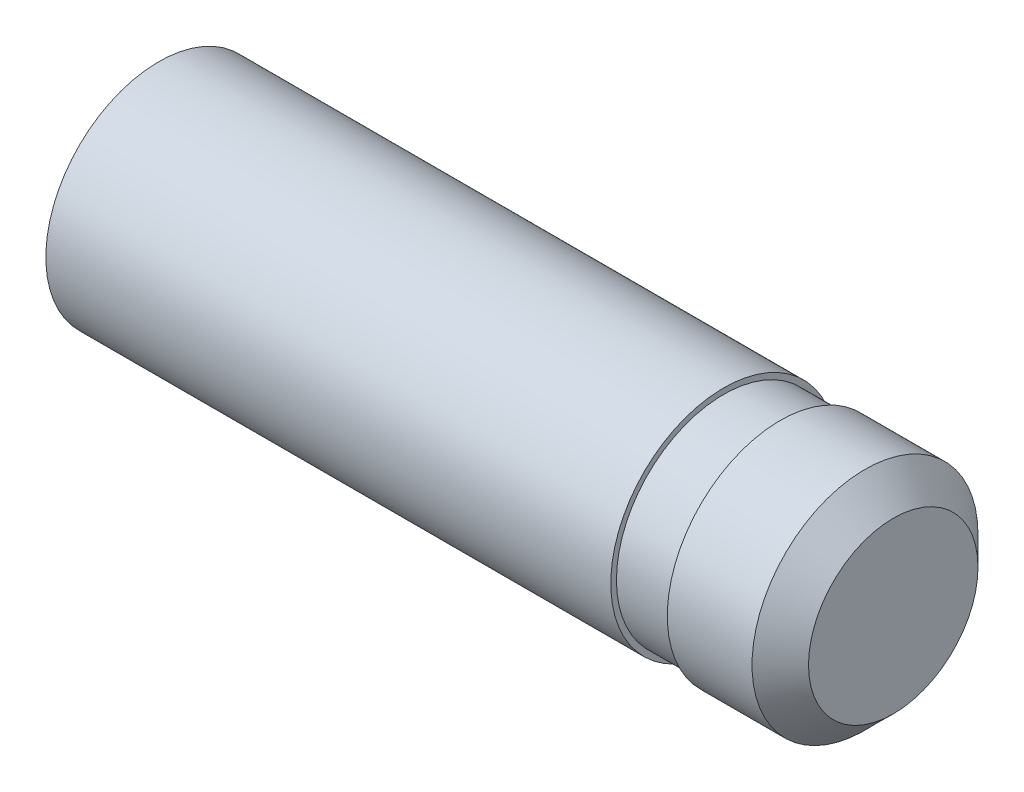
ISO-10303-21;
HEADER;
FILE_DESCRIPTION(('STEP AP214'),'2;1');
FILE_NAME('part.step','',(''),(''),'','','');
FILE_SCHEMA(('AUTOMOTIVE_DESIGN { 1 0 10303 214 1 1 1 1 }'));
ENDSEC;
DATA;
#1=APPLICATION_CONTEXT('core data for automotive mechanical design processes');
#2=APPLICATION_PROTOCOL_DEFINITION('international standard','automotive_design',2000,#1);
#3=PRODUCT_CONTEXT('',#1,'mechanical');
#4=PRODUCT('Part','Part','',(#3));
#5=PRODUCT_RELATED_PRODUCT_CATEGORY('part','',(#4));
#6=PRODUCT_DEFINITION_FORMATION('','',#4);
#7=PRODUCT_DEFINITION_CONTEXT('part definition',#1,'design');
#8=PRODUCT_DEFINITION('design','',#6,#7);
#9=PRODUCT_DEFINITION_SHAPE('','',#8);
#10=(LENGTH_UNIT() NAMED_UNIT(*) SI_UNIT(.MILLI.,.METRE.));
#11=(NAMED_UNIT(*) PLANE_ANGLE_UNIT() SI_UNIT($,.RADIAN.));
#12=(NAMED_UNIT(*) SI_UNIT($,.STERADIAN.) SOLID_ANGLE_UNIT());
#13=UNCERTAINTY_MEASURE_WITH_UNIT(LENGTH_MEASURE(1.E-05),#10,'distance_accuracy_value','');
#14=(GEOMETRIC_REPRESENTATION_CONTEXT(3) GLOBAL_UNCERTAINTY_ASSIGNED_CONTEXT((#13)) GLOBAL_UNIT_ASSIGNED_CONTEXT((#10,
#11,#12)) REPRESENTATION_CONTEXT('',''));
#15=CARTESIAN_POINT('',(0.,0.,0.));
#16=DIRECTION('',(0.,0.,1.));
#17=DIRECTION('',(1.,0.,0.));
#18=AXIS2_PLACEMENT_3D('',#15,#16,#17);
#19=CARTESIAN_POINT('',(10.,0.,0.));
#20=DIRECTION('',(-1.,0.,0.));
#21=DIRECTION('',(0.,0.,1.));
#22=AXIS2_PLACEMENT_3D('',#19,#20,#21);
#23=CYLINDRICAL_SURFACE('',#22,2.);
#24=CARTESIAN_POINT('',(10.,0.,0.));
#25=DIRECTION('',(1.,0.,0.));
#26=DIRECTION('',(0.,0.,-1.));
#27=AXIS2_PLACEMENT_3D('',#24,#25,#26);
#28=CIRCLE('',#27,2.);
#29=CARTESIAN_POINT('',(10.,0.,-2.));
#30=VERTEX_POINT('',#29);
#31=EDGE_CURVE('E55',#30,#30,#28,.T.);
#32=ORIENTED_EDGE('',*,*,#31,.F.);
#33=EDGE_LOOP('',(#32));
#34=FACE_BOUND('',#33,.T.);
#35=CARTESIAN_POINT('',(0.,0.,0.));
#36=DIRECTION('',(1.,0.,0.));
#37=DIRECTION('',(0.,0.,-1.));
#38=AXIS2_PLACEMENT_3D('',#35,#36,#37);
#39=CIRCLE('',#38,2.);
#40=CARTESIAN_POINT('',(0.,0.,-2.));
#41=VERTEX_POINT('',#40);
#42=EDGE_CURVE('E58',#41,#41,#39,.T.);
#43=ORIENTED_EDGE('',*,*,#42,.T.);
#44=EDGE_LOOP('',(#43));
#45=FACE_BOUND('',#44,.T.);
#46=ADVANCED_FACE('F39',(#34,#45),#23,.T.);
#47=CARTESIAN_POINT('',(10.,0.,0.));
#48=DIRECTION('',(1.,0.,0.));
#49=DIRECTION('',(0.,0.,-1.));
#50=AXIS2_PLACEMENT_3D('',#47,#48,#49);
#51=PLANE('',#50);
#52=CARTESIAN_POINT('',(10.,0.,0.));
#53=DIRECTION('',(1.,0.,0.));
#54=DIRECTION('',(0.,0.,-1.));
#55=AXIS2_PLACEMENT_3D('',#52,#53,#54);
#56=CIRCLE('',#55,1.9);
#57=CARTESIAN_POINT('',(10.,0.,-1.9));
#58=VERTEX_POINT('',#57);
#59=EDGE_CURVE('E51',#58,#58,#56,.T.);
#60=ORIENTED_EDGE('',*,*,#59,.F.);
#61=EDGE_LOOP('',(#60));
#62=FACE_BOUND('',#61,.T.);
#63=ORIENTED_EDGE('',*,*,#31,.T.);
#64=EDGE_LOOP('',(#63));
#65=FACE_BOUND('',#64,.T.);
#66=ADVANCED_FACE('F87',(#62,#65),#51,.T.);
#67=CARTESIAN_POINT('',(0.,0.,0.));
#68=DIRECTION('',(1.,0.,0.));
#69=DIRECTION('',(0.,0.,-1.));
#70=AXIS2_PLACEMENT_3D('',#67,#68,#69);
#71=PLANE('',#70);
#72=ORIENTED_EDGE('',*,*,#42,.F.);
#73=EDGE_LOOP('',(#72));
#74=FACE_BOUND('',#73,.T.);
#75=ADVANCED_FACE('F93',(#74),#71,.F.);
#76=CARTESIAN_POINT('',(11.,0.,0.));
#77=DIRECTION('',(-1.,0.,0.));
#78=DIRECTION('',(0.,0.,1.));
#79=AXIS2_PLACEMENT_3D('',#76,#77,#78);
#80=CYLINDRICAL_SURFACE('',#79,1.9);
#81=CARTESIAN_POINT('',(11.,0.,0.));
#82=DIRECTION('',(1.,0.,0.));
#83=DIRECTION('',(0.,0.,-1.));
#84=AXIS2_PLACEMENT_3D('',#81,#82,#83);
#85=CIRCLE('',#84,1.9);
#86=CARTESIAN_POINT('',(11.,0.,-1.9));
#87=VERTEX_POINT('',#86);
#88=EDGE_CURVE('E61',#87,#87,#85,.T.);
#89=ORIENTED_EDGE('',*,*,#88,.F.);
#90=EDGE_LOOP('',(#89));
#91=FACE_BOUND('',#90,.T.);
#92=ORIENTED_EDGE('',*,*,#59,.T.);
#93=EDGE_LOOP('',(#92));
#94=FACE_BOUND('',#93,.T.);
#95=ADVANCED_FACE('F99',(#91,#94),#80,.T.);
#96=CARTESIAN_POINT('',(13.,0.,0.));
#97=DIRECTION('',(-1.,0.,0.));
#98=DIRECTION('',(0.,0.,1.));
#99=AXIS2_PLACEMENT_3D('',#96,#97,#98);
#100=CYLINDRICAL_SURFACE('',#99,2.);
#101=CARTESIAN_POINT('',(12.5,0.,0.));
#102=DIRECTION('',(1.,0.,0.));
#103=DIRECTION('',(0.,0.,-1.));
#104=AXIS2_PLACEMENT_3D('',#101,#102,#103);
#105=CIRCLE('',#104,2.);
#106=CARTESIAN_POINT('',(12.5,0.,-2.));
#107=VERTEX_POINT('',#106);
#108=EDGE_CURVE('E10',#107,#107,#105,.F.);
#109=ORIENTED_EDGE('',*,*,#108,.T.);
#110=EDGE_LOOP('',(#109));
#111=FACE_BOUND('',#110,.T.);
#112=CARTESIAN_POINT('',(11.,0.,0.));
#113=DIRECTION('',(1.,0.,0.));
#114=DIRECTION('',(0.,0.,-1.));
#115=AXIS2_PLACEMENT_3D('',#112,#113,#114);
#116=CIRCLE('',#115,2.);
#117=CARTESIAN_POINT('',(11.,0.,-2.));
#118=VERTEX_POINT('',#117);
#119=EDGE_CURVE('E66',#118,#118,#116,.T.);
#120=ORIENTED_EDGE('',*,*,#119,.T.);
#121=EDGE_LOOP('',(#120));
#122=FACE_BOUND('',#121,.T.);
#123=ADVANCED_FACE('F70',(#111,#122),#100,.T.);
#124=CARTESIAN_POINT('',(13.,0.,0.));
#125=DIRECTION('',(1.,0.,0.));
#126=DIRECTION('',(0.,0.,-1.));
#127=AXIS2_PLACEMENT_3D('',#124,#125,#126);
#128=PLANE('',#127);
#129=CARTESIAN_POINT('',(13.,0.,0.));
#130=DIRECTION('',(1.,0.,0.));
#131=DIRECTION('',(0.,0.,-1.));
#132=AXIS2_PLACEMENT_3D('',#129,#130,#131);
#133=CIRCLE('',#132,1.5);
#134=CARTESIAN_POINT('',(13.,0.,-1.5));
#135=VERTEX_POINT('',#134);
#136=EDGE_CURVE('E47',#135,#135,#133,.T.);
#137=ORIENTED_EDGE('',*,*,#136,.T.);
#138=EDGE_LOOP('',(#137));
#139=FACE_BOUND('',#138,.T.);
#140=ADVANCED_FACE('F74',(#139),#128,.T.);
#141=CARTESIAN_POINT('',(11.,0.,0.));
#142=DIRECTION('',(1.,0.,0.));
#143=DIRECTION('',(0.,0.,-1.));
#144=AXIS2_PLACEMENT_3D('',#141,#142,#143);
#145=PLANE('',#144);
#146=ORIENTED_EDGE('',*,*,#88,.T.);
#147=EDGE_LOOP('',(#146));
#148=FACE_BOUND('',#147,.T.);
#149=ORIENTED_EDGE('',*,*,#119,.F.);
#150=EDGE_LOOP('',(#149));
#151=FACE_BOUND('',#150,.T.);
#152=ADVANCED_FACE('F72',(#148,#151),#145,.F.);
#153=CARTESIAN_POINT('',(13.,0.,0.));
#154=DIRECTION('',(-1.,0.,0.));
#155=DIRECTION('',(0.,0.,1.));
#156=AXIS2_PLACEMENT_3D('',#153,#154,#155);
#157=CONICAL_SURFACE('',#156,1.5,0.785398163397447);
#158=ORIENTED_EDGE('',*,*,#108,.F.);
#159=EDGE_LOOP('',(#158));
#160=FACE_BOUND('',#159,.T.);
#161=ORIENTED_EDGE('',*,*,#136,.F.);
#162=EDGE_LOOP('',(#161));
#163=FACE_BOUND('',#162,.T.);
#164=ADVANCED_FACE('F42',(#160,#163),#157,.T.);
#165=CLOSED_SHELL('',(#46,#66,#75,#95,#123,#140,#152,#164));
#166=MANIFOLD_SOLID_BREP('B2',#165);
#167=ADVANCED_BREP_SHAPE_REPRESENTATION('',(#18,#166),#14);
#168=SHAPE_DEFINITION_REPRESENTATION(#9,#167);
ENDSEC;
END-ISO-10303-21;
